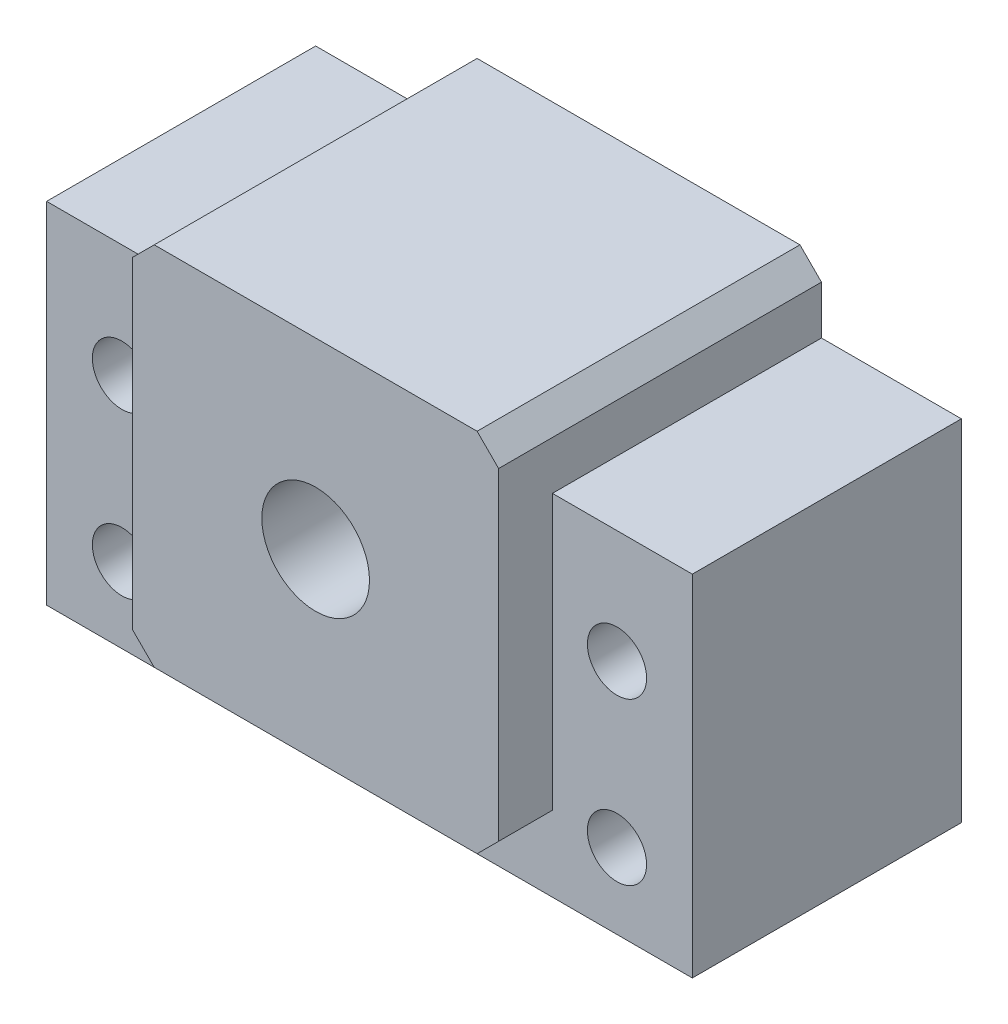
ISO-10303-21;
HEADER;
FILE_DESCRIPTION(('STEP AP214'),'2;1');
FILE_NAME('part.step','',(''),(''),'','','');
FILE_SCHEMA(('AUTOMOTIVE_DESIGN { 1 0 10303 214 1 1 1 1 }'));
ENDSEC;
DATA;
#1=APPLICATION_CONTEXT('core data for automotive mechanical design processes');
#2=APPLICATION_PROTOCOL_DEFINITION('international standard','automotive_design',2000,#1);
#3=PRODUCT_CONTEXT('',#1,'mechanical');
#4=PRODUCT('Part','Part','',(#3));
#5=PRODUCT_RELATED_PRODUCT_CATEGORY('part','',(#4));
#6=PRODUCT_DEFINITION_FORMATION('','',#4);
#7=PRODUCT_DEFINITION_CONTEXT('part definition',#1,'design');
#8=PRODUCT_DEFINITION('design','',#6,#7);
#9=PRODUCT_DEFINITION_SHAPE('','',#8);
#10=(LENGTH_UNIT() NAMED_UNIT(*) SI_UNIT(.MILLI.,.METRE.));
#11=(NAMED_UNIT(*) PLANE_ANGLE_UNIT() SI_UNIT($,.RADIAN.));
#12=(NAMED_UNIT(*) SI_UNIT($,.STERADIAN.) SOLID_ANGLE_UNIT());
#13=UNCERTAINTY_MEASURE_WITH_UNIT(LENGTH_MEASURE(1.E-05),#10,'distance_accuracy_value','');
#14=(GEOMETRIC_REPRESENTATION_CONTEXT(3) GLOBAL_UNCERTAINTY_ASSIGNED_CONTEXT((#13)) GLOBAL_UNIT_ASSIGNED_CONTEXT((#10,
#11,#12)) REPRESENTATION_CONTEXT('',''));
#15=CARTESIAN_POINT('',(0.,0.,0.));
#16=DIRECTION('',(0.,0.,1.));
#17=DIRECTION('',(1.,0.,0.));
#18=AXIS2_PLACEMENT_3D('',#15,#16,#17);
#19=CARTESIAN_POINT('',(0.,0.,5.));
#20=DIRECTION('',(0.,0.,-1.));
#21=DIRECTION('',(-1.,0.,0.));
#22=AXIS2_PLACEMENT_3D('',#19,#20,#21);
#23=PLANE('',#22);
#24=DIRECTION('',(-0.707106781186551,-0.707106781186544,0.));
#25=VECTOR('',#24,1.);
#26=CARTESIAN_POINT('',(-15.,17.,5.));
#27=LINE('',#26,#25);
#28=CARTESIAN_POINT('',(-15.,17.,5.));
#29=VERTEX_POINT('',#28);
#30=CARTESIAN_POINT('',(-17.,15.,5.));
#31=VERTEX_POINT('',#30);
#32=EDGE_CURVE('E141',#29,#31,#27,.T.);
#33=ORIENTED_EDGE('',*,*,#32,.T.);
#34=DIRECTION('',(0.,-1.,0.));
#35=VECTOR('',#34,1.);
#36=CARTESIAN_POINT('',(-17.,15.,5.));
#37=LINE('',#36,#35);
#38=CARTESIAN_POINT('',(-17.,-15.,5.));
#39=VERTEX_POINT('',#38);
#40=EDGE_CURVE('E235',#31,#39,#37,.T.);
#41=ORIENTED_EDGE('',*,*,#40,.T.);
#42=DIRECTION('',(0.707106781186551,-0.707106781186544,0.));
#43=VECTOR('',#42,1.);
#44=CARTESIAN_POINT('',(-15.,-17.,5.));
#45=LINE('',#44,#43);
#46=CARTESIAN_POINT('',(-15.,-17.,5.));
#47=VERTEX_POINT('',#46);
#48=EDGE_CURVE('E239',#39,#47,#45,.T.);
#49=ORIENTED_EDGE('',*,*,#48,.T.);
#50=DIRECTION('',(1.,0.,0.));
#51=VECTOR('',#50,1.);
#52=CARTESIAN_POINT('',(15.,-17.,5.));
#53=LINE('',#52,#51);
#54=CARTESIAN_POINT('',(15.,-17.,5.));
#55=VERTEX_POINT('',#54);
#56=EDGE_CURVE('E242',#47,#55,#53,.T.);
#57=ORIENTED_EDGE('',*,*,#56,.T.);
#58=DIRECTION('',(0.707106781186551,0.707106781186544,0.));
#59=VECTOR('',#58,1.);
#60=CARTESIAN_POINT('',(15.,-17.,5.));
#61=LINE('',#60,#59);
#62=CARTESIAN_POINT('',(17.,-15.,5.));
#63=VERTEX_POINT('',#62);
#64=EDGE_CURVE('E245',#55,#63,#61,.T.);
#65=ORIENTED_EDGE('',*,*,#64,.T.);
#66=DIRECTION('',(0.,1.,0.));
#67=VECTOR('',#66,1.);
#68=CARTESIAN_POINT('',(17.,15.,5.));
#69=LINE('',#68,#67);
#70=CARTESIAN_POINT('',(17.,15.,5.));
#71=VERTEX_POINT('',#70);
#72=EDGE_CURVE('E248',#63,#71,#69,.T.);
#73=ORIENTED_EDGE('',*,*,#72,.T.);
#74=DIRECTION('',(-0.707106781186551,0.707106781186544,0.));
#75=VECTOR('',#74,1.);
#76=CARTESIAN_POINT('',(15.,17.,5.));
#77=LINE('',#76,#75);
#78=CARTESIAN_POINT('',(15.,17.,5.));
#79=VERTEX_POINT('',#78);
#80=EDGE_CURVE('E251',#71,#79,#77,.T.);
#81=ORIENTED_EDGE('',*,*,#80,.T.);
#82=DIRECTION('',(-1.,0.,0.));
#83=VECTOR('',#82,1.);
#84=CARTESIAN_POINT('',(15.,17.,5.));
#85=LINE('',#84,#83);
#86=EDGE_CURVE('E56',#79,#29,#85,.T.);
#87=ORIENTED_EDGE('',*,*,#86,.T.);
#88=EDGE_LOOP('',(#33,#41,#49,#57,#65,#73,#81,#87));
#89=FACE_BOUND('',#88,.T.);
#90=CARTESIAN_POINT('',(0.,0.,5.));
#91=DIRECTION('',(0.,0.,1.));
#92=DIRECTION('',(1.,0.,0.));
#93=AXIS2_PLACEMENT_3D('',#90,#91,#92);
#94=CIRCLE('',#93,5.);
#95=CARTESIAN_POINT('',(5.,0.,5.));
#96=VERTEX_POINT('',#95);
#97=EDGE_CURVE('E228',#96,#96,#94,.T.);
#98=ORIENTED_EDGE('',*,*,#97,.F.);
#99=EDGE_LOOP('',(#98));
#100=FACE_BOUND('',#99,.T.);
#101=ADVANCED_FACE('F39',(#89,#100),#23,.F.);
#102=CARTESIAN_POINT('',(-15.,17.,5.));
#103=DIRECTION('',(0.707106781186544,-0.707106781186551,0.));
#104=DIRECTION('',(0.707106781186551,0.707106781186544,0.));
#105=AXIS2_PLACEMENT_3D('',#102,#103,#104);
#106=PLANE('',#105);
#107=DIRECTION('',(0.,0.,-1.));
#108=VECTOR('',#107,1.);
#109=CARTESIAN_POINT('',(-15.,17.,5.));
#110=LINE('',#109,#108);
#111=CARTESIAN_POINT('',(-15.,17.,-25.));
#112=VERTEX_POINT('',#111);
#113=EDGE_CURVE('E136',#29,#112,#110,.T.);
#114=ORIENTED_EDGE('',*,*,#113,.T.);
#115=DIRECTION('',(0.707106781186551,0.707106781186543,0.));
#116=VECTOR('',#115,1.);
#117=CARTESIAN_POINT('',(-15.,17.,-25.));
#118=LINE('',#117,#116);
#119=CARTESIAN_POINT('',(-17.,15.,-25.));
#120=VERTEX_POINT('',#119);
#121=EDGE_CURVE('E140',#120,#112,#118,.T.);
#122=ORIENTED_EDGE('',*,*,#121,.F.);
#123=DIRECTION('',(0.,0.,-1.));
#124=VECTOR('',#123,1.);
#125=CARTESIAN_POINT('',(-17.,15.,5.));
#126=LINE('',#125,#124);
#127=EDGE_CURVE('E11',#31,#120,#126,.T.);
#128=ORIENTED_EDGE('',*,*,#127,.F.);
#129=ORIENTED_EDGE('',*,*,#32,.F.);
#130=EDGE_LOOP('',(#114,#122,#128,#129));
#131=FACE_BOUND('',#130,.T.);
#132=ADVANCED_FACE('F41',(#131),#106,.F.);
#133=CARTESIAN_POINT('',(-17.,15.,5.));
#134=DIRECTION('',(1.,0.,0.));
#135=DIRECTION('',(0.,0.,-1.));
#136=AXIS2_PLACEMENT_3D('',#133,#134,#135);
#137=PLANE('',#136);
#138=ORIENTED_EDGE('',*,*,#127,.T.);
#139=DIRECTION('',(0.,1.,0.));
#140=VECTOR('',#139,1.);
#141=CARTESIAN_POINT('',(-17.,15.,-25.));
#142=LINE('',#141,#140);
#143=CARTESIAN_POINT('',(-17.,10.5,-25.));
#144=VERTEX_POINT('',#143);
#145=EDGE_CURVE('E160',#144,#120,#142,.T.);
#146=ORIENTED_EDGE('',*,*,#145,.F.);
#147=DIRECTION('',(0.,0.,1.));
#148=VECTOR('',#147,1.);
#149=CARTESIAN_POINT('',(-17.,10.5,-25.));
#150=LINE('',#149,#148);
#151=CARTESIAN_POINT('',(-17.,10.5,0.));
#152=VERTEX_POINT('',#151);
#153=EDGE_CURVE('E194',#144,#152,#150,.T.);
#154=ORIENTED_EDGE('',*,*,#153,.T.);
#155=DIRECTION('',(0.,-1.,0.));
#156=VECTOR('',#155,1.);
#157=CARTESIAN_POINT('',(-17.,15.,0.));
#158=LINE('',#157,#156);
#159=CARTESIAN_POINT('',(-17.,-15.,0.));
#160=VERTEX_POINT('',#159);
#161=EDGE_CURVE('E232',#152,#160,#158,.T.);
#162=ORIENTED_EDGE('',*,*,#161,.T.);
#163=DIRECTION('',(0.,0.,-1.));
#164=VECTOR('',#163,1.);
#165=CARTESIAN_POINT('',(-17.,-15.,5.));
#166=LINE('',#165,#164);
#167=EDGE_CURVE('E49',#39,#160,#166,.T.);
#168=ORIENTED_EDGE('',*,*,#167,.F.);
#169=ORIENTED_EDGE('',*,*,#40,.F.);
#170=EDGE_LOOP('',(#138,#146,#154,#162,#168,#169));
#171=FACE_BOUND('',#170,.T.);
#172=ADVANCED_FACE('F299',(#171),#137,.F.);
#173=CARTESIAN_POINT('',(-15.,-17.,5.));
#174=DIRECTION('',(0.707106781186544,0.707106781186551,0.));
#175=DIRECTION('',(-0.707106781186551,0.707106781186544,0.));
#176=AXIS2_PLACEMENT_3D('',#173,#174,#175);
#177=PLANE('',#176);
#178=DIRECTION('',(0.707106781186551,-0.707106781186544,0.));
#179=VECTOR('',#178,1.);
#180=CARTESIAN_POINT('',(-15.,-17.,0.));
#181=LINE('',#180,#179);
#182=CARTESIAN_POINT('',(-15.,-17.,0.));
#183=VERTEX_POINT('',#182);
#184=EDGE_CURVE('E259',#160,#183,#181,.T.);
#185=ORIENTED_EDGE('',*,*,#184,.T.);
#186=DIRECTION('',(0.,0.,-1.));
#187=VECTOR('',#186,1.);
#188=CARTESIAN_POINT('',(-15.,-17.,5.));
#189=LINE('',#188,#187);
#190=EDGE_CURVE('E287',#47,#183,#189,.T.);
#191=ORIENTED_EDGE('',*,*,#190,.F.);
#192=ORIENTED_EDGE('',*,*,#48,.F.);
#193=ORIENTED_EDGE('',*,*,#167,.T.);
#194=EDGE_LOOP('',(#185,#191,#192,#193));
#195=FACE_BOUND('',#194,.T.);
#196=ADVANCED_FACE('F295',(#195),#177,.F.);
#197=CARTESIAN_POINT('',(15.,-17.,5.));
#198=DIRECTION('',(0.,1.,0.));
#199=DIRECTION('',(0.,0.,1.));
#200=AXIS2_PLACEMENT_3D('',#197,#198,#199);
#201=PLANE('',#200);
#202=DIRECTION('',(1.,0.,0.));
#203=VECTOR('',#202,1.);
#204=CARTESIAN_POINT('',(15.,-17.,0.));
#205=LINE('',#204,#203);
#206=CARTESIAN_POINT('',(15.,-17.,0.));
#207=VERTEX_POINT('',#206);
#208=EDGE_CURVE('E263',#183,#207,#205,.T.);
#209=ORIENTED_EDGE('',*,*,#208,.T.);
#210=DIRECTION('',(0.,0.,-1.));
#211=VECTOR('',#210,1.);
#212=CARTESIAN_POINT('',(15.,-17.,5.));
#213=LINE('',#212,#211);
#214=EDGE_CURVE('E283',#55,#207,#213,.T.);
#215=ORIENTED_EDGE('',*,*,#214,.F.);
#216=ORIENTED_EDGE('',*,*,#56,.F.);
#217=ORIENTED_EDGE('',*,*,#190,.T.);
#218=EDGE_LOOP('',(#209,#215,#216,#217));
#219=FACE_BOUND('',#218,.T.);
#220=ADVANCED_FACE('F339',(#219),#201,.F.);
#221=CARTESIAN_POINT('',(15.,-17.,5.));
#222=DIRECTION('',(-0.707106781186544,0.707106781186551,0.));
#223=DIRECTION('',(-0.707106781186551,-0.707106781186544,0.));
#224=AXIS2_PLACEMENT_3D('',#221,#222,#223);
#225=PLANE('',#224);
#226=DIRECTION('',(0.707106781186551,0.707106781186544,0.));
#227=VECTOR('',#226,1.);
#228=CARTESIAN_POINT('',(15.,-17.,0.));
#229=LINE('',#228,#227);
#230=CARTESIAN_POINT('',(17.,-15.,0.));
#231=VERTEX_POINT('',#230);
#232=EDGE_CURVE('E267',#207,#231,#229,.T.);
#233=ORIENTED_EDGE('',*,*,#232,.T.);
#234=DIRECTION('',(0.,0.,-1.));
#235=VECTOR('',#234,1.);
#236=CARTESIAN_POINT('',(17.,-15.,5.));
#237=LINE('',#236,#235);
#238=EDGE_CURVE('E279',#63,#231,#237,.T.);
#239=ORIENTED_EDGE('',*,*,#238,.F.);
#240=ORIENTED_EDGE('',*,*,#64,.F.);
#241=ORIENTED_EDGE('',*,*,#214,.T.);
#242=EDGE_LOOP('',(#233,#239,#240,#241));
#243=FACE_BOUND('',#242,.T.);
#244=ADVANCED_FACE('F336',(#243),#225,.F.);
#245=CARTESIAN_POINT('',(17.,15.,5.));
#246=DIRECTION('',(-1.,0.,0.));
#247=DIRECTION('',(0.,0.,1.));
#248=AXIS2_PLACEMENT_3D('',#245,#246,#247);
#249=PLANE('',#248);
#250=DIRECTION('',(0.,1.,0.));
#251=VECTOR('',#250,1.);
#252=CARTESIAN_POINT('',(17.,15.,0.));
#253=LINE('',#252,#251);
#254=CARTESIAN_POINT('',(17.,10.5,0.));
#255=VERTEX_POINT('',#254);
#256=EDGE_CURVE('E236',#231,#255,#253,.T.);
#257=ORIENTED_EDGE('',*,*,#256,.T.);
#258=DIRECTION('',(0.,0.,1.));
#259=VECTOR('',#258,1.);
#260=CARTESIAN_POINT('',(17.,10.5,-25.));
#261=LINE('',#260,#259);
#262=CARTESIAN_POINT('',(17.,10.5,-25.));
#263=VERTEX_POINT('',#262);
#264=EDGE_CURVE('E225',#263,#255,#261,.T.);
#265=ORIENTED_EDGE('',*,*,#264,.F.);
#266=DIRECTION('',(0.,-1.,0.));
#267=VECTOR('',#266,1.);
#268=CARTESIAN_POINT('',(17.,15.,-25.));
#269=LINE('',#268,#267);
#270=CARTESIAN_POINT('',(17.,15.,-25.));
#271=VERTEX_POINT('',#270);
#272=EDGE_CURVE('E174',#271,#263,#269,.T.);
#273=ORIENTED_EDGE('',*,*,#272,.F.);
#274=DIRECTION('',(0.,0.,-1.));
#275=VECTOR('',#274,1.);
#276=CARTESIAN_POINT('',(17.,15.,5.));
#277=LINE('',#276,#275);
#278=EDGE_CURVE('E276',#71,#271,#277,.T.);
#279=ORIENTED_EDGE('',*,*,#278,.F.);
#280=ORIENTED_EDGE('',*,*,#72,.F.);
#281=ORIENTED_EDGE('',*,*,#238,.T.);
#282=EDGE_LOOP('',(#257,#265,#273,#279,#280,#281));
#283=FACE_BOUND('',#282,.T.);
#284=ADVANCED_FACE('F329',(#283),#249,.F.);
#285=CARTESIAN_POINT('',(15.,17.,5.));
#286=DIRECTION('',(-0.707106781186544,-0.707106781186551,0.));
#287=DIRECTION('',(0.707106781186551,-0.707106781186544,0.));
#288=AXIS2_PLACEMENT_3D('',#285,#286,#287);
#289=PLANE('',#288);
#290=ORIENTED_EDGE('',*,*,#278,.T.);
#291=DIRECTION('',(0.707106781186551,-0.707106781186544,0.));
#292=VECTOR('',#291,1.);
#293=CARTESIAN_POINT('',(15.,17.,-25.));
#294=LINE('',#293,#292);
#295=CARTESIAN_POINT('',(15.,17.,-25.));
#296=VERTEX_POINT('',#295);
#297=EDGE_CURVE('E154',#296,#271,#294,.T.);
#298=ORIENTED_EDGE('',*,*,#297,.F.);
#299=DIRECTION('',(0.,0.,-1.));
#300=VECTOR('',#299,1.);
#301=CARTESIAN_POINT('',(15.,17.,5.));
#302=LINE('',#301,#300);
#303=EDGE_CURVE('E144',#79,#296,#302,.T.);
#304=ORIENTED_EDGE('',*,*,#303,.F.);
#305=ORIENTED_EDGE('',*,*,#80,.F.);
#306=EDGE_LOOP('',(#290,#298,#304,#305));
#307=FACE_BOUND('',#306,.T.);
#308=ADVANCED_FACE('F344',(#307),#289,.F.);
#309=CARTESIAN_POINT('',(15.,17.,5.));
#310=DIRECTION('',(0.,-1.,0.));
#311=DIRECTION('',(0.,0.,-1.));
#312=AXIS2_PLACEMENT_3D('',#309,#310,#311);
#313=PLANE('',#312);
#314=ORIENTED_EDGE('',*,*,#303,.T.);
#315=DIRECTION('',(1.,0.,0.));
#316=VECTOR('',#315,1.);
#317=CARTESIAN_POINT('',(-15.,17.,-25.));
#318=LINE('',#317,#316);
#319=EDGE_CURVE('E147',#112,#296,#318,.T.);
#320=ORIENTED_EDGE('',*,*,#319,.F.);
#321=ORIENTED_EDGE('',*,*,#113,.F.);
#322=ORIENTED_EDGE('',*,*,#86,.F.);
#323=EDGE_LOOP('',(#314,#320,#321,#322));
#324=FACE_BOUND('',#323,.T.);
#325=ADVANCED_FACE('F148',(#324),#313,.F.);
#326=CARTESIAN_POINT('',(0.,0.,5.));
#327=DIRECTION('',(0.,0.,-1.));
#328=DIRECTION('',(-1.,0.,0.));
#329=AXIS2_PLACEMENT_3D('',#326,#327,#328);
#330=CYLINDRICAL_SURFACE('',#329,5.);
#331=ORIENTED_EDGE('',*,*,#97,.T.);
#332=EDGE_LOOP('',(#331));
#333=FACE_BOUND('',#332,.T.);
#334=CARTESIAN_POINT('',(0.,0.,-25.));
#335=DIRECTION('',(0.,0.,-1.));
#336=DIRECTION('',(-1.,0.,0.));
#337=AXIS2_PLACEMENT_3D('',#334,#335,#336);
#338=CIRCLE('',#337,5.);
#339=CARTESIAN_POINT('',(-5.,0.,-25.));
#340=VERTEX_POINT('',#339);
#341=EDGE_CURVE('E169',#340,#340,#338,.T.);
#342=ORIENTED_EDGE('',*,*,#341,.T.);
#343=EDGE_LOOP('',(#342));
#344=FACE_BOUND('',#343,.T.);
#345=ADVANCED_FACE('F351',(#333,#344),#330,.F.);
#346=CARTESIAN_POINT('',(0.,0.,0.));
#347=DIRECTION('',(0.,0.,1.));
#348=DIRECTION('',(1.,0.,0.));
#349=AXIS2_PLACEMENT_3D('',#346,#347,#348);
#350=PLANE('',#349);
#351=CARTESIAN_POINT('',(-23.,0.,0.));
#352=DIRECTION('',(0.,0.,-1.));
#353=DIRECTION('',(1.,0.,0.));
#354=AXIS2_PLACEMENT_3D('',#351,#352,#353);
#355=CIRCLE('',#354,2.75);
#356=CARTESIAN_POINT('',(-20.25,0.,0.));
#357=VERTEX_POINT('',#356);
#358=EDGE_CURVE('E401',#357,#357,#355,.T.);
#359=ORIENTED_EDGE('',*,*,#358,.T.);
#360=EDGE_LOOP('',(#359));
#361=FACE_BOUND('',#360,.T.);
#362=CARTESIAN_POINT('',(23.,-15.,0.));
#363=DIRECTION('',(0.,0.,-1.));
#364=DIRECTION('',(-1.,0.,0.));
#365=AXIS2_PLACEMENT_3D('',#362,#363,#364);
#366=CIRCLE('',#365,2.75);
#367=CARTESIAN_POINT('',(20.25,-15.,0.));
#368=VERTEX_POINT('',#367);
#369=EDGE_CURVE('E412',#368,#368,#366,.T.);
#370=ORIENTED_EDGE('',*,*,#369,.T.);
#371=EDGE_LOOP('',(#370));
#372=FACE_BOUND('',#371,.T.);
#373=CARTESIAN_POINT('',(23.,0.,0.));
#374=DIRECTION('',(0.,0.,-1.));
#375=DIRECTION('',(-1.,0.,0.));
#376=AXIS2_PLACEMENT_3D('',#373,#374,#375);
#377=CIRCLE('',#376,2.75);
#378=CARTESIAN_POINT('',(20.25,0.,0.));
#379=VERTEX_POINT('',#378);
#380=EDGE_CURVE('E420',#379,#379,#377,.T.);
#381=ORIENTED_EDGE('',*,*,#380,.T.);
#382=EDGE_LOOP('',(#381));
#383=FACE_BOUND('',#382,.T.);
#384=CARTESIAN_POINT('',(-23.,-15.,0.));
#385=DIRECTION('',(0.,0.,-1.));
#386=DIRECTION('',(1.,0.,0.));
#387=AXIS2_PLACEMENT_3D('',#384,#385,#386);
#388=CIRCLE('',#387,2.75);
#389=CARTESIAN_POINT('',(-20.25,-15.,0.));
#390=VERTEX_POINT('',#389);
#391=EDGE_CURVE('E405',#390,#390,#388,.T.);
#392=ORIENTED_EDGE('',*,*,#391,.T.);
#393=EDGE_LOOP('',(#392));
#394=FACE_BOUND('',#393,.T.);
#395=ORIENTED_EDGE('',*,*,#256,.F.);
#396=ORIENTED_EDGE('',*,*,#232,.F.);
#397=ORIENTED_EDGE('',*,*,#208,.F.);
#398=ORIENTED_EDGE('',*,*,#184,.F.);
#399=ORIENTED_EDGE('',*,*,#161,.F.);
#400=DIRECTION('',(1.,0.,0.));
#401=VECTOR('',#400,1.);
#402=CARTESIAN_POINT('',(-17.,10.5,0.));
#403=LINE('',#402,#401);
#404=CARTESIAN_POINT('',(-30.,10.5,0.));
#405=VERTEX_POINT('',#404);
#406=EDGE_CURVE('E162',#405,#152,#403,.T.);
#407=ORIENTED_EDGE('',*,*,#406,.F.);
#408=DIRECTION('',(0.,1.,0.));
#409=VECTOR('',#408,1.);
#410=CARTESIAN_POINT('',(-30.,10.5,0.));
#411=LINE('',#410,#409);
#412=CARTESIAN_POINT('',(-30.,-22.,0.));
#413=VERTEX_POINT('',#412);
#414=EDGE_CURVE('E166',#413,#405,#411,.T.);
#415=ORIENTED_EDGE('',*,*,#414,.F.);
#416=DIRECTION('',(-1.,0.,0.));
#417=VECTOR('',#416,1.);
#418=CARTESIAN_POINT('',(30.,-22.,0.));
#419=LINE('',#418,#417);
#420=CARTESIAN_POINT('',(30.,-22.,0.));
#421=VERTEX_POINT('',#420);
#422=EDGE_CURVE('E201',#421,#413,#419,.T.);
#423=ORIENTED_EDGE('',*,*,#422,.F.);
#424=DIRECTION('',(0.,-1.,0.));
#425=VECTOR('',#424,1.);
#426=CARTESIAN_POINT('',(30.,10.5,0.));
#427=LINE('',#426,#425);
#428=CARTESIAN_POINT('',(30.,10.5,0.));
#429=VERTEX_POINT('',#428);
#430=EDGE_CURVE('E198',#429,#421,#427,.T.);
#431=ORIENTED_EDGE('',*,*,#430,.F.);
#432=DIRECTION('',(1.,0.,0.));
#433=VECTOR('',#432,1.);
#434=CARTESIAN_POINT('',(17.,10.5,0.));
#435=LINE('',#434,#433);
#436=EDGE_CURVE('E195',#255,#429,#435,.T.);
#437=ORIENTED_EDGE('',*,*,#436,.F.);
#438=EDGE_LOOP('',(#395,#396,#397,#398,#399,#407,#415,#423,#431,#437));
#439=FACE_BOUND('',#438,.T.);
#440=ADVANCED_FACE('F303',(#361,#372,#383,#394,#439),#350,.T.);
#441=CARTESIAN_POINT('',(0.,0.,-25.));
#442=DIRECTION('',(0.,0.,1.));
#443=DIRECTION('',(1.,0.,0.));
#444=AXIS2_PLACEMENT_3D('',#441,#442,#443);
#445=PLANE('',#444);
#446=ORIENTED_EDGE('',*,*,#121,.T.);
#447=ORIENTED_EDGE('',*,*,#319,.T.);
#448=ORIENTED_EDGE('',*,*,#297,.T.);
#449=ORIENTED_EDGE('',*,*,#272,.T.);
#450=DIRECTION('',(1.,0.,0.));
#451=VECTOR('',#450,1.);
#452=CARTESIAN_POINT('',(17.,10.5,-25.));
#453=LINE('',#452,#451);
#454=CARTESIAN_POINT('',(30.,10.5,-25.));
#455=VERTEX_POINT('',#454);
#456=EDGE_CURVE('E177',#263,#455,#453,.T.);
#457=ORIENTED_EDGE('',*,*,#456,.T.);
#458=DIRECTION('',(0.,-1.,0.));
#459=VECTOR('',#458,1.);
#460=CARTESIAN_POINT('',(30.,10.5,-25.));
#461=LINE('',#460,#459);
#462=CARTESIAN_POINT('',(30.,-22.,-25.));
#463=VERTEX_POINT('',#462);
#464=EDGE_CURVE('E180',#455,#463,#461,.T.);
#465=ORIENTED_EDGE('',*,*,#464,.T.);
#466=DIRECTION('',(-1.,0.,0.));
#467=VECTOR('',#466,1.);
#468=CARTESIAN_POINT('',(30.,-22.,-25.));
#469=LINE('',#468,#467);
#470=CARTESIAN_POINT('',(-30.,-22.,-25.));
#471=VERTEX_POINT('',#470);
#472=EDGE_CURVE('E183',#463,#471,#469,.T.);
#473=ORIENTED_EDGE('',*,*,#472,.T.);
#474=DIRECTION('',(0.,1.,0.));
#475=VECTOR('',#474,1.);
#476=CARTESIAN_POINT('',(-30.,10.5,-25.));
#477=LINE('',#476,#475);
#478=CARTESIAN_POINT('',(-30.,10.5,-25.));
#479=VERTEX_POINT('',#478);
#480=EDGE_CURVE('E186',#471,#479,#477,.T.);
#481=ORIENTED_EDGE('',*,*,#480,.T.);
#482=DIRECTION('',(1.,0.,0.));
#483=VECTOR('',#482,1.);
#484=CARTESIAN_POINT('',(-17.,10.5,-25.));
#485=LINE('',#484,#483);
#486=EDGE_CURVE('E189',#479,#144,#485,.T.);
#487=ORIENTED_EDGE('',*,*,#486,.T.);
#488=ORIENTED_EDGE('',*,*,#145,.T.);
#489=EDGE_LOOP('',(#446,#447,#448,#449,#457,#465,#473,#481,#487,#488));
#490=FACE_BOUND('',#489,.T.);
#491=ORIENTED_EDGE('',*,*,#341,.F.);
#492=EDGE_LOOP('',(#491));
#493=FACE_BOUND('',#492,.T.);
#494=CARTESIAN_POINT('',(23.,0.,-25.));
#495=DIRECTION('',(0.,0.,-1.));
#496=DIRECTION('',(-1.,0.,0.));
#497=AXIS2_PLACEMENT_3D('',#494,#495,#496);
#498=CIRCLE('',#497,2.75);
#499=CARTESIAN_POINT('',(20.25,0.,-25.));
#500=VERTEX_POINT('',#499);
#501=EDGE_CURVE('E424',#500,#500,#498,.T.);
#502=ORIENTED_EDGE('',*,*,#501,.F.);
#503=EDGE_LOOP('',(#502));
#504=FACE_BOUND('',#503,.T.);
#505=CARTESIAN_POINT('',(23.,-15.,-25.));
#506=DIRECTION('',(0.,0.,-1.));
#507=DIRECTION('',(-1.,0.,0.));
#508=AXIS2_PLACEMENT_3D('',#505,#506,#507);
#509=CIRCLE('',#508,2.75);
#510=CARTESIAN_POINT('',(20.25,-15.,-25.));
#511=VERTEX_POINT('',#510);
#512=EDGE_CURVE('E416',#511,#511,#509,.T.);
#513=ORIENTED_EDGE('',*,*,#512,.F.);
#514=EDGE_LOOP('',(#513));
#515=FACE_BOUND('',#514,.T.);
#516=CARTESIAN_POINT('',(-23.,-15.,-25.));
#517=DIRECTION('',(0.,0.,-1.));
#518=DIRECTION('',(1.,0.,0.));
#519=AXIS2_PLACEMENT_3D('',#516,#517,#518);
#520=CIRCLE('',#519,2.75);
#521=CARTESIAN_POINT('',(-20.25,-15.,-25.));
#522=VERTEX_POINT('',#521);
#523=EDGE_CURVE('E408',#522,#522,#520,.T.);
#524=ORIENTED_EDGE('',*,*,#523,.F.);
#525=EDGE_LOOP('',(#524));
#526=FACE_BOUND('',#525,.T.);
#527=CARTESIAN_POINT('',(-23.,0.,-25.));
#528=DIRECTION('',(0.,0.,-1.));
#529=DIRECTION('',(1.,0.,0.));
#530=AXIS2_PLACEMENT_3D('',#527,#528,#529);
#531=CIRCLE('',#530,2.75);
#532=CARTESIAN_POINT('',(-20.25,0.,-25.));
#533=VERTEX_POINT('',#532);
#534=EDGE_CURVE('E398',#533,#533,#531,.T.);
#535=ORIENTED_EDGE('',*,*,#534,.F.);
#536=EDGE_LOOP('',(#535));
#537=FACE_BOUND('',#536,.T.);
#538=ADVANCED_FACE('F157',(#490,#493,#504,#515,#526,#537),#445,.F.);
#539=CARTESIAN_POINT('',(17.,10.5,-25.));
#540=DIRECTION('',(0.,-1.,0.));
#541=DIRECTION('',(1.,0.,0.));
#542=AXIS2_PLACEMENT_3D('',#539,#540,#541);
#543=PLANE('',#542);
#544=ORIENTED_EDGE('',*,*,#436,.T.);
#545=DIRECTION('',(0.,0.,1.));
#546=VECTOR('',#545,1.);
#547=CARTESIAN_POINT('',(30.,10.5,-25.));
#548=LINE('',#547,#546);
#549=EDGE_CURVE('E221',#455,#429,#548,.T.);
#550=ORIENTED_EDGE('',*,*,#549,.F.);
#551=ORIENTED_EDGE('',*,*,#456,.F.);
#552=ORIENTED_EDGE('',*,*,#264,.T.);
#553=EDGE_LOOP('',(#544,#550,#551,#552));
#554=FACE_BOUND('',#553,.T.);
#555=ADVANCED_FACE('F326',(#554),#543,.F.);
#556=CARTESIAN_POINT('',(30.,10.5,-25.));
#557=DIRECTION('',(-1.,0.,0.));
#558=DIRECTION('',(0.,-1.,0.));
#559=AXIS2_PLACEMENT_3D('',#556,#557,#558);
#560=PLANE('',#559);
#561=ORIENTED_EDGE('',*,*,#430,.T.);
#562=DIRECTION('',(0.,0.,1.));
#563=VECTOR('',#562,1.);
#564=CARTESIAN_POINT('',(30.,-22.,-25.));
#565=LINE('',#564,#563);
#566=EDGE_CURVE('E217',#463,#421,#565,.T.);
#567=ORIENTED_EDGE('',*,*,#566,.F.);
#568=ORIENTED_EDGE('',*,*,#464,.F.);
#569=ORIENTED_EDGE('',*,*,#549,.T.);
#570=EDGE_LOOP('',(#561,#567,#568,#569));
#571=FACE_BOUND('',#570,.T.);
#572=ADVANCED_FACE('F322',(#571),#560,.F.);
#573=CARTESIAN_POINT('',(30.,-22.,-25.));
#574=DIRECTION('',(0.,1.,0.));
#575=DIRECTION('',(-1.,0.,0.));
#576=AXIS2_PLACEMENT_3D('',#573,#574,#575);
#577=PLANE('',#576);
#578=ORIENTED_EDGE('',*,*,#422,.T.);
#579=DIRECTION('',(0.,0.,1.));
#580=VECTOR('',#579,1.);
#581=CARTESIAN_POINT('',(-30.,-22.,-25.));
#582=LINE('',#581,#580);
#583=EDGE_CURVE('E213',#471,#413,#582,.T.);
#584=ORIENTED_EDGE('',*,*,#583,.F.);
#585=ORIENTED_EDGE('',*,*,#472,.F.);
#586=ORIENTED_EDGE('',*,*,#566,.T.);
#587=EDGE_LOOP('',(#578,#584,#585,#586));
#588=FACE_BOUND('',#587,.T.);
#589=ADVANCED_FACE('F317',(#588),#577,.F.);
#590=CARTESIAN_POINT('',(-30.,10.5,-25.));
#591=DIRECTION('',(1.,0.,0.));
#592=DIRECTION('',(0.,1.,0.));
#593=AXIS2_PLACEMENT_3D('',#590,#591,#592);
#594=PLANE('',#593);
#595=ORIENTED_EDGE('',*,*,#414,.T.);
#596=DIRECTION('',(0.,0.,1.));
#597=VECTOR('',#596,1.);
#598=CARTESIAN_POINT('',(-30.,10.5,-25.));
#599=LINE('',#598,#597);
#600=EDGE_CURVE('E209',#479,#405,#599,.T.);
#601=ORIENTED_EDGE('',*,*,#600,.F.);
#602=ORIENTED_EDGE('',*,*,#480,.F.);
#603=ORIENTED_EDGE('',*,*,#583,.T.);
#604=EDGE_LOOP('',(#595,#601,#602,#603));
#605=FACE_BOUND('',#604,.T.);
#606=ADVANCED_FACE('F311',(#605),#594,.F.);
#607=CARTESIAN_POINT('',(-17.,10.5,-25.));
#608=DIRECTION('',(0.,-1.,0.));
#609=DIRECTION('',(0.,0.,-1.));
#610=AXIS2_PLACEMENT_3D('',#607,#608,#609);
#611=PLANE('',#610);
#612=ORIENTED_EDGE('',*,*,#406,.T.);
#613=ORIENTED_EDGE('',*,*,#153,.F.);
#614=ORIENTED_EDGE('',*,*,#486,.F.);
#615=ORIENTED_EDGE('',*,*,#600,.T.);
#616=EDGE_LOOP('',(#612,#613,#614,#615));
#617=FACE_BOUND('',#616,.T.);
#618=ADVANCED_FACE('F306',(#617),#611,.F.);
#619=CARTESIAN_POINT('',(23.,0.,-25.));
#620=DIRECTION('',(0.,0.,1.));
#621=DIRECTION('',(1.,0.,0.));
#622=AXIS2_PLACEMENT_3D('',#619,#620,#621);
#623=CYLINDRICAL_SURFACE('',#622,2.75);
#624=ORIENTED_EDGE('',*,*,#501,.T.);
#625=EDGE_LOOP('',(#624));
#626=FACE_BOUND('',#625,.T.);
#627=ORIENTED_EDGE('',*,*,#380,.F.);
#628=EDGE_LOOP('',(#627));
#629=FACE_BOUND('',#628,.T.);
#630=ADVANCED_FACE('F373',(#626,#629),#623,.F.);
#631=CARTESIAN_POINT('',(23.,-15.,-25.));
#632=DIRECTION('',(0.,0.,1.));
#633=DIRECTION('',(1.,0.,0.));
#634=AXIS2_PLACEMENT_3D('',#631,#632,#633);
#635=CYLINDRICAL_SURFACE('',#634,2.75);
#636=ORIENTED_EDGE('',*,*,#512,.T.);
#637=EDGE_LOOP('',(#636));
#638=FACE_BOUND('',#637,.T.);
#639=ORIENTED_EDGE('',*,*,#369,.F.);
#640=EDGE_LOOP('',(#639));
#641=FACE_BOUND('',#640,.T.);
#642=ADVANCED_FACE('F381',(#638,#641),#635,.F.);
#643=CARTESIAN_POINT('',(-23.,-15.,-25.));
#644=DIRECTION('',(0.,0.,1.));
#645=DIRECTION('',(1.,0.,0.));
#646=AXIS2_PLACEMENT_3D('',#643,#644,#645);
#647=CYLINDRICAL_SURFACE('',#646,2.75);
#648=ORIENTED_EDGE('',*,*,#523,.T.);
#649=EDGE_LOOP('',(#648));
#650=FACE_BOUND('',#649,.T.);
#651=ORIENTED_EDGE('',*,*,#391,.F.);
#652=EDGE_LOOP('',(#651));
#653=FACE_BOUND('',#652,.T.);
#654=ADVANCED_FACE('F385',(#650,#653),#647,.F.);
#655=CARTESIAN_POINT('',(-23.,0.,-25.));
#656=DIRECTION('',(0.,0.,1.));
#657=DIRECTION('',(1.,0.,0.));
#658=AXIS2_PLACEMENT_3D('',#655,#656,#657);
#659=CYLINDRICAL_SURFACE('',#658,2.75);
#660=ORIENTED_EDGE('',*,*,#534,.T.);
#661=EDGE_LOOP('',(#660));
#662=FACE_BOUND('',#661,.T.);
#663=ORIENTED_EDGE('',*,*,#358,.F.);
#664=EDGE_LOOP('',(#663));
#665=FACE_BOUND('',#664,.T.);
#666=ADVANCED_FACE('F389',(#662,#665),#659,.F.);
#667=CLOSED_SHELL('',(#101,#132,#172,#196,#220,#244,#284,#308,#325,#345,#440,#538,#555,#572,
#589,#606,#618,#630,#642,#654,#666));
#668=MANIFOLD_SOLID_BREP('B2',#667);
#669=ADVANCED_BREP_SHAPE_REPRESENTATION('',(#18,#668),#14);
#670=SHAPE_DEFINITION_REPRESENTATION(#9,#669);
ENDSEC;
END-ISO-10303-21;
